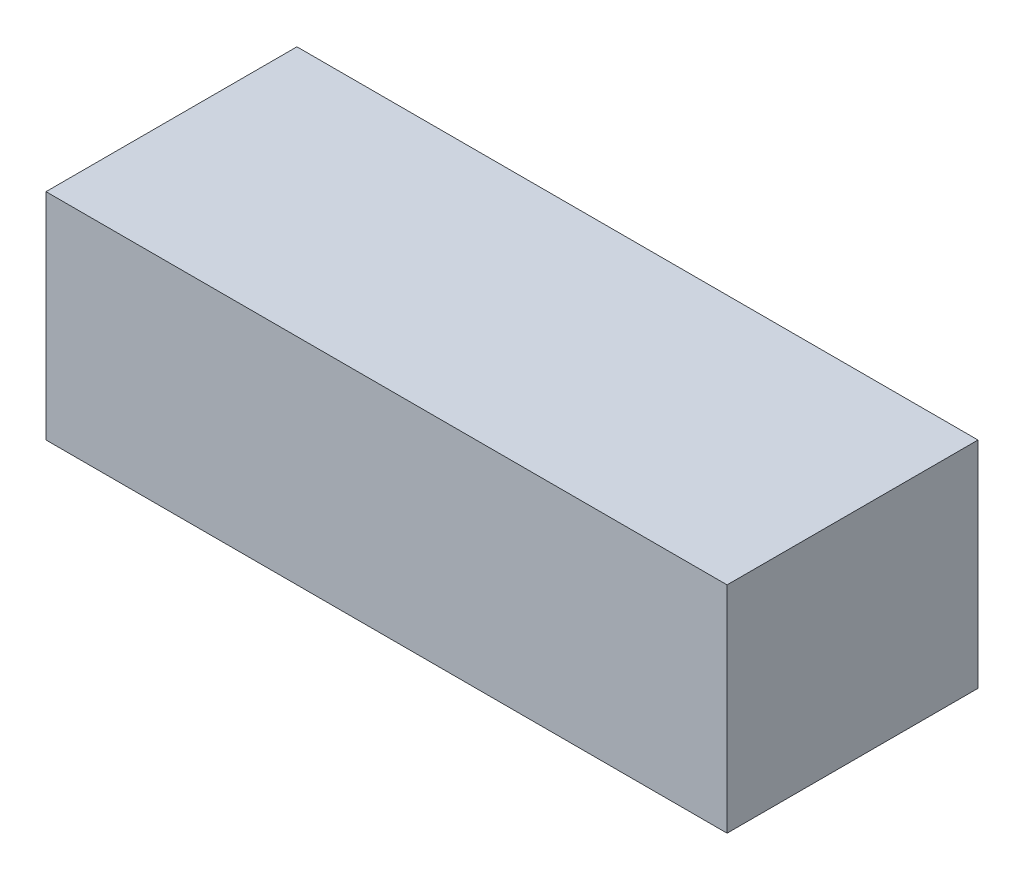
ISO-10303-21;
HEADER;
FILE_DESCRIPTION(('STEP AP214'),'2;1');
FILE_NAME('part.step','',(''),(''),'','','');
FILE_SCHEMA(('AUTOMOTIVE_DESIGN { 1 0 10303 214 1 1 1 1 }'));
ENDSEC;
DATA;
#1=APPLICATION_CONTEXT('core data for automotive mechanical design processes');
#2=APPLICATION_PROTOCOL_DEFINITION('international standard','automotive_design',2000,#1);
#3=PRODUCT_CONTEXT('',#1,'mechanical');
#4=PRODUCT('Part','Part','',(#3));
#5=PRODUCT_RELATED_PRODUCT_CATEGORY('part','',(#4));
#6=PRODUCT_DEFINITION_FORMATION('','',#4);
#7=PRODUCT_DEFINITION_CONTEXT('part definition',#1,'design');
#8=PRODUCT_DEFINITION('design','',#6,#7);
#9=PRODUCT_DEFINITION_SHAPE('','',#8);
#10=(LENGTH_UNIT() NAMED_UNIT(*) SI_UNIT(.MILLI.,.METRE.));
#11=(NAMED_UNIT(*) PLANE_ANGLE_UNIT() SI_UNIT($,.RADIAN.));
#12=(NAMED_UNIT(*) SI_UNIT($,.STERADIAN.) SOLID_ANGLE_UNIT());
#13=UNCERTAINTY_MEASURE_WITH_UNIT(LENGTH_MEASURE(1.E-05),#10,'distance_accuracy_value','');
#14=(GEOMETRIC_REPRESENTATION_CONTEXT(3) GLOBAL_UNCERTAINTY_ASSIGNED_CONTEXT((#13)) GLOBAL_UNIT_ASSIGNED_CONTEXT((#10,
#11,#12)) REPRESENTATION_CONTEXT('',''));
#15=CARTESIAN_POINT('',(0.,0.,0.));
#16=DIRECTION('',(0.,0.,1.));
#17=DIRECTION('',(1.,0.,0.));
#18=AXIS2_PLACEMENT_3D('',#15,#16,#17);
#19=CARTESIAN_POINT('',(0.,48.,0.));
#20=DIRECTION('',(1.,0.,0.));
#21=DIRECTION('',(0.,0.,-1.));
#22=AXIS2_PLACEMENT_3D('',#19,#20,#21);
#23=PLANE('',#22);
#24=DIRECTION('',(0.,0.,1.));
#25=VECTOR('',#24,1.);
#26=CARTESIAN_POINT('',(0.,0.,0.));
#27=LINE('',#26,#25);
#28=CARTESIAN_POINT('',(0.,0.,-56.));
#29=VERTEX_POINT('',#28);
#30=CARTESIAN_POINT('',(0.,0.,0.));
#31=VERTEX_POINT('',#30);
#32=EDGE_CURVE('E95',#29,#31,#27,.T.);
#33=ORIENTED_EDGE('',*,*,#32,.T.);
#34=DIRECTION('',(0.,-1.,0.));
#35=VECTOR('',#34,1.);
#36=CARTESIAN_POINT('',(0.,48.,0.));
#37=LINE('',#36,#35);
#38=CARTESIAN_POINT('',(0.,48.,0.));
#39=VERTEX_POINT('',#38);
#40=EDGE_CURVE('E11',#39,#31,#37,.T.);
#41=ORIENTED_EDGE('',*,*,#40,.F.);
#42=DIRECTION('',(0.,0.,1.));
#43=VECTOR('',#42,1.);
#44=CARTESIAN_POINT('',(0.,48.,0.));
#45=LINE('',#44,#43);
#46=CARTESIAN_POINT('',(0.,48.,-56.));
#47=VERTEX_POINT('',#46);
#48=EDGE_CURVE('E83',#47,#39,#45,.T.);
#49=ORIENTED_EDGE('',*,*,#48,.F.);
#50=DIRECTION('',(0.,-1.,0.));
#51=VECTOR('',#50,1.);
#52=CARTESIAN_POINT('',(0.,48.,-56.));
#53=LINE('',#52,#51);
#54=EDGE_CURVE('E91',#47,#29,#53,.T.);
#55=ORIENTED_EDGE('',*,*,#54,.T.);
#56=EDGE_LOOP('',(#33,#41,#49,#55));
#57=FACE_BOUND('',#56,.T.);
#58=ADVANCED_FACE('F32',(#57),#23,.F.);
#59=CARTESIAN_POINT('',(0.,48.,0.));
#60=DIRECTION('',(0.,0.,-1.));
#61=DIRECTION('',(-1.,0.,0.));
#62=AXIS2_PLACEMENT_3D('',#59,#60,#61);
#63=PLANE('',#62);
#64=DIRECTION('',(1.,0.,0.));
#65=VECTOR('',#64,1.);
#66=CARTESIAN_POINT('',(0.,0.,0.));
#67=LINE('',#66,#65);
#68=CARTESIAN_POINT('',(152.,0.,0.));
#69=VERTEX_POINT('',#68);
#70=EDGE_CURVE('E87',#31,#69,#67,.T.);
#71=ORIENTED_EDGE('',*,*,#70,.T.);
#72=DIRECTION('',(0.,-1.,0.));
#73=VECTOR('',#72,1.);
#74=CARTESIAN_POINT('',(152.,48.,0.));
#75=LINE('',#74,#73);
#76=CARTESIAN_POINT('',(152.,48.,0.));
#77=VERTEX_POINT('',#76);
#78=EDGE_CURVE('E40',#77,#69,#75,.T.);
#79=ORIENTED_EDGE('',*,*,#78,.F.);
#80=DIRECTION('',(1.,0.,0.));
#81=VECTOR('',#80,1.);
#82=CARTESIAN_POINT('',(0.,48.,0.));
#83=LINE('',#82,#81);
#84=EDGE_CURVE('E78',#39,#77,#83,.T.);
#85=ORIENTED_EDGE('',*,*,#84,.F.);
#86=ORIENTED_EDGE('',*,*,#40,.T.);
#87=EDGE_LOOP('',(#71,#79,#85,#86));
#88=FACE_BOUND('',#87,.T.);
#89=ADVANCED_FACE('F86',(#88),#63,.F.);
#90=CARTESIAN_POINT('',(152.,48.,0.));
#91=DIRECTION('',(-1.,0.,0.));
#92=DIRECTION('',(0.,0.,1.));
#93=AXIS2_PLACEMENT_3D('',#90,#91,#92);
#94=PLANE('',#93);
#95=DIRECTION('',(0.,0.,-1.));
#96=VECTOR('',#95,1.);
#97=CARTESIAN_POINT('',(152.,0.,0.));
#98=LINE('',#97,#96);
#99=CARTESIAN_POINT('',(152.,0.,-56.));
#100=VERTEX_POINT('',#99);
#101=EDGE_CURVE('E65',#69,#100,#98,.T.);
#102=ORIENTED_EDGE('',*,*,#101,.T.);
#103=DIRECTION('',(0.,-1.,0.));
#104=VECTOR('',#103,1.);
#105=CARTESIAN_POINT('',(152.,48.,-56.));
#106=LINE('',#105,#104);
#107=CARTESIAN_POINT('',(152.,48.,-56.));
#108=VERTEX_POINT('',#107);
#109=EDGE_CURVE('E88',#108,#100,#106,.T.);
#110=ORIENTED_EDGE('',*,*,#109,.F.);
#111=DIRECTION('',(0.,0.,-1.));
#112=VECTOR('',#111,1.);
#113=CARTESIAN_POINT('',(152.,48.,0.));
#114=LINE('',#113,#112);
#115=EDGE_CURVE('E81',#77,#108,#114,.T.);
#116=ORIENTED_EDGE('',*,*,#115,.F.);
#117=ORIENTED_EDGE('',*,*,#78,.T.);
#118=EDGE_LOOP('',(#102,#110,#116,#117));
#119=FACE_BOUND('',#118,.T.);
#120=ADVANCED_FACE('F89',(#119),#94,.F.);
#121=CARTESIAN_POINT('',(0.,48.,-56.));
#122=DIRECTION('',(0.,0.,1.));
#123=DIRECTION('',(1.,0.,0.));
#124=AXIS2_PLACEMENT_3D('',#121,#122,#123);
#125=PLANE('',#124);
#126=DIRECTION('',(-1.,0.,0.));
#127=VECTOR('',#126,1.);
#128=CARTESIAN_POINT('',(0.,0.,-56.));
#129=LINE('',#128,#127);
#130=EDGE_CURVE('E71',#100,#29,#129,.T.);
#131=ORIENTED_EDGE('',*,*,#130,.T.);
#132=ORIENTED_EDGE('',*,*,#54,.F.);
#133=DIRECTION('',(-1.,0.,0.));
#134=VECTOR('',#133,1.);
#135=CARTESIAN_POINT('',(0.,48.,-56.));
#136=LINE('',#135,#134);
#137=EDGE_CURVE('E48',#108,#47,#136,.T.);
#138=ORIENTED_EDGE('',*,*,#137,.F.);
#139=ORIENTED_EDGE('',*,*,#109,.T.);
#140=EDGE_LOOP('',(#131,#132,#138,#139));
#141=FACE_BOUND('',#140,.T.);
#142=ADVANCED_FACE('F102',(#141),#125,.F.);
#143=CARTESIAN_POINT('',(0.,48.,0.));
#144=DIRECTION('',(0.,-1.,0.));
#145=DIRECTION('',(0.,0.,-1.));
#146=AXIS2_PLACEMENT_3D('',#143,#144,#145);
#147=PLANE('',#146);
#148=ORIENTED_EDGE('',*,*,#48,.T.);
#149=ORIENTED_EDGE('',*,*,#84,.T.);
#150=ORIENTED_EDGE('',*,*,#115,.T.);
#151=ORIENTED_EDGE('',*,*,#137,.T.);
#152=EDGE_LOOP('',(#148,#149,#150,#151));
#153=FACE_BOUND('',#152,.T.);
#154=ADVANCED_FACE('F79',(#153),#147,.F.);
#155=CARTESIAN_POINT('',(0.,0.,0.));
#156=DIRECTION('',(0.,-1.,0.));
#157=DIRECTION('',(0.,0.,-1.));
#158=AXIS2_PLACEMENT_3D('',#155,#156,#157);
#159=PLANE('',#158);
#160=ORIENTED_EDGE('',*,*,#32,.F.);
#161=ORIENTED_EDGE('',*,*,#130,.F.);
#162=ORIENTED_EDGE('',*,*,#101,.F.);
#163=ORIENTED_EDGE('',*,*,#70,.F.);
#164=EDGE_LOOP('',(#160,#161,#162,#163));
#165=FACE_BOUND('',#164,.T.);
#166=ADVANCED_FACE('F105',(#165),#159,.T.);
#167=CLOSED_SHELL('',(#58,#89,#120,#142,#154,#166));
#168=MANIFOLD_SOLID_BREP('B2',#167);
#169=ADVANCED_BREP_SHAPE_REPRESENTATION('',(#18,#168),#14);
#170=SHAPE_DEFINITION_REPRESENTATION(#9,#169);
ENDSEC;
END-ISO-10303-21;
